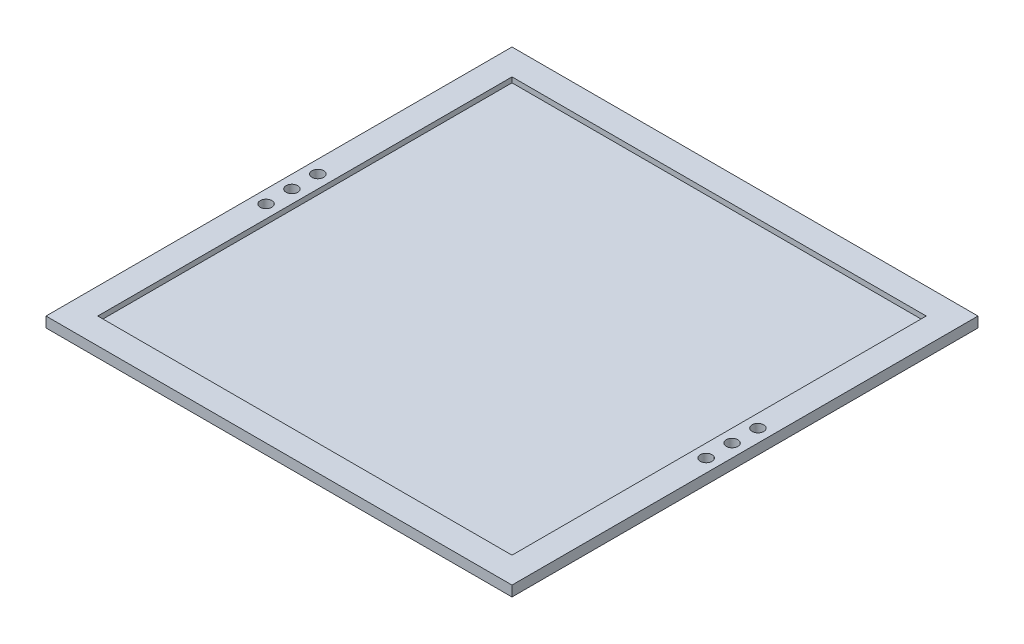
ISO-10303-21;
HEADER;
FILE_DESCRIPTION(('STEP AP214'),'2;1');
FILE_NAME('part.step','',(''),(''),'','','');
FILE_SCHEMA(('AUTOMOTIVE_DESIGN { 1 0 10303 214 1 1 1 1 }'));
ENDSEC;
DATA;
#1=APPLICATION_CONTEXT('core data for automotive mechanical design processes');
#2=APPLICATION_PROTOCOL_DEFINITION('international standard','automotive_design',2000,#1);
#3=PRODUCT_CONTEXT('',#1,'mechanical');
#4=PRODUCT('Part','Part','',(#3));
#5=PRODUCT_RELATED_PRODUCT_CATEGORY('part','',(#4));
#6=PRODUCT_DEFINITION_FORMATION('','',#4);
#7=PRODUCT_DEFINITION_CONTEXT('part definition',#1,'design');
#8=PRODUCT_DEFINITION('design','',#6,#7);
#9=PRODUCT_DEFINITION_SHAPE('','',#8);
#10=(LENGTH_UNIT() NAMED_UNIT(*) SI_UNIT(.MILLI.,.METRE.));
#11=(NAMED_UNIT(*) PLANE_ANGLE_UNIT() SI_UNIT($,.RADIAN.));
#12=(NAMED_UNIT(*) SI_UNIT($,.STERADIAN.) SOLID_ANGLE_UNIT());
#13=UNCERTAINTY_MEASURE_WITH_UNIT(LENGTH_MEASURE(1.E-05),#10,'distance_accuracy_value','');
#14=(GEOMETRIC_REPRESENTATION_CONTEXT(3) GLOBAL_UNCERTAINTY_ASSIGNED_CONTEXT((#13)) GLOBAL_UNIT_ASSIGNED_CONTEXT((#10,
#11,#12)) REPRESENTATION_CONTEXT('',''));
#15=CARTESIAN_POINT('',(0.,0.,0.));
#16=DIRECTION('',(0.,0.,1.));
#17=DIRECTION('',(1.,0.,0.));
#18=AXIS2_PLACEMENT_3D('',#15,#16,#17);
#19=CARTESIAN_POINT('',(0.,0.,0.));
#20=DIRECTION('',(0.,1.,0.));
#21=DIRECTION('',(0.,0.,1.));
#22=AXIS2_PLACEMENT_3D('',#19,#20,#21);
#23=PLANE('',#22);
#24=CARTESIAN_POINT('',(-85.,0.,0.));
#25=DIRECTION('',(0.,1.,0.));
#26=DIRECTION('',(0.,0.,1.));
#27=AXIS2_PLACEMENT_3D('',#24,#25,#26);
#28=CIRCLE('',#27,2.25);
#29=CARTESIAN_POINT('',(-85.,0.,2.25000000000001));
#30=VERTEX_POINT('',#29);
#31=EDGE_CURVE('E440',#30,#30,#28,.T.);
#32=ORIENTED_EDGE('',*,*,#31,.T.);
#33=EDGE_LOOP('',(#32));
#34=FACE_BOUND('',#33,.T.);
#35=CARTESIAN_POINT('',(-85.,0.,10.));
#36=DIRECTION('',(0.,1.,0.));
#37=DIRECTION('',(0.,0.,1.));
#38=AXIS2_PLACEMENT_3D('',#35,#36,#37);
#39=CIRCLE('',#38,2.25);
#40=CARTESIAN_POINT('',(-85.,0.,12.25));
#41=VERTEX_POINT('',#40);
#42=EDGE_CURVE('E439',#41,#41,#39,.T.);
#43=ORIENTED_EDGE('',*,*,#42,.T.);
#44=EDGE_LOOP('',(#43));
#45=FACE_BOUND('',#44,.T.);
#46=CARTESIAN_POINT('',(-85.,0.,-9.99999999999998));
#47=DIRECTION('',(0.,1.,0.));
#48=DIRECTION('',(0.,0.,1.));
#49=AXIS2_PLACEMENT_3D('',#46,#47,#48);
#50=CIRCLE('',#49,2.25);
#51=CARTESIAN_POINT('',(-85.,0.,-7.74999999999998));
#52=VERTEX_POINT('',#51);
#53=EDGE_CURVE('E178',#52,#52,#50,.T.);
#54=ORIENTED_EDGE('',*,*,#53,.T.);
#55=EDGE_LOOP('',(#54));
#56=FACE_BOUND('',#55,.T.);
#57=DIRECTION('',(0.,0.,1.));
#58=VECTOR('',#57,1.);
#59=CARTESIAN_POINT('',(90.,0.,0.));
#60=LINE('',#59,#58);
#61=CARTESIAN_POINT('',(90.,0.,-90.));
#62=VERTEX_POINT('',#61);
#63=CARTESIAN_POINT('',(90.,0.,90.));
#64=VERTEX_POINT('',#63);
#65=EDGE_CURVE('E107',#62,#64,#60,.T.);
#66=ORIENTED_EDGE('',*,*,#65,.T.);
#67=DIRECTION('',(-1.,0.,0.));
#68=VECTOR('',#67,1.);
#69=CARTESIAN_POINT('',(-1.2490009027033E-13,0.,90.0000000000002));
#70=LINE('',#69,#68);
#71=CARTESIAN_POINT('',(-90.,0.,90.));
#72=VERTEX_POINT('',#71);
#73=EDGE_CURVE('E166',#64,#72,#70,.T.);
#74=ORIENTED_EDGE('',*,*,#73,.T.);
#75=DIRECTION('',(0.,0.,-1.));
#76=VECTOR('',#75,1.);
#77=CARTESIAN_POINT('',(-90.,0.,0.));
#78=LINE('',#77,#76);
#79=CARTESIAN_POINT('',(-90.,0.,-90.));
#80=VERTEX_POINT('',#79);
#81=EDGE_CURVE('E163',#72,#80,#78,.T.);
#82=ORIENTED_EDGE('',*,*,#81,.T.);
#83=DIRECTION('',(1.,0.,0.));
#84=VECTOR('',#83,1.);
#85=CARTESIAN_POINT('',(0.,0.,-90.));
#86=LINE('',#85,#84);
#87=EDGE_CURVE('E161',#80,#62,#86,.T.);
#88=ORIENTED_EDGE('',*,*,#87,.T.);
#89=EDGE_LOOP('',(#66,#74,#82,#88));
#90=FACE_BOUND('',#89,.T.);
#91=CARTESIAN_POINT('',(85.,0.,10.));
#92=DIRECTION('',(0.,1.,0.));
#93=DIRECTION('',(0.,0.,1.));
#94=AXIS2_PLACEMENT_3D('',#91,#92,#93);
#95=CIRCLE('',#94,2.25);
#96=CARTESIAN_POINT('',(85.,0.,12.25));
#97=VERTEX_POINT('',#96);
#98=EDGE_CURVE('E450',#97,#97,#95,.F.);
#99=ORIENTED_EDGE('',*,*,#98,.F.);
#100=EDGE_LOOP('',(#99));
#101=FACE_BOUND('',#100,.T.);
#102=CARTESIAN_POINT('',(85.,0.,0.));
#103=DIRECTION('',(0.,1.,0.));
#104=DIRECTION('',(0.,0.,1.));
#105=AXIS2_PLACEMENT_3D('',#102,#103,#104);
#106=CIRCLE('',#105,2.25);
#107=CARTESIAN_POINT('',(85.,0.,2.25000000000001));
#108=VERTEX_POINT('',#107);
#109=EDGE_CURVE('E445',#108,#108,#106,.F.);
#110=ORIENTED_EDGE('',*,*,#109,.F.);
#111=EDGE_LOOP('',(#110));
#112=FACE_BOUND('',#111,.T.);
#113=CARTESIAN_POINT('',(85.,0.,-9.99999999999998));
#114=DIRECTION('',(0.,1.,0.));
#115=DIRECTION('',(0.,0.,1.));
#116=AXIS2_PLACEMENT_3D('',#113,#114,#115);
#117=CIRCLE('',#116,2.25);
#118=CARTESIAN_POINT('',(85.,0.,-7.74999999999998));
#119=VERTEX_POINT('',#118);
#120=EDGE_CURVE('E441',#119,#119,#117,.F.);
#121=ORIENTED_EDGE('',*,*,#120,.F.);
#122=EDGE_LOOP('',(#121));
#123=FACE_BOUND('',#122,.T.);
#124=ADVANCED_FACE('F39',(#34,#45,#56,#90,#101,#112,#123),#23,.F.);
#125=CARTESIAN_POINT('',(0.,4.,0.));
#126=DIRECTION('',(0.,1.,0.));
#127=DIRECTION('',(0.,0.,1.));
#128=AXIS2_PLACEMENT_3D('',#125,#126,#127);
#129=PLANE('',#128);
#130=CARTESIAN_POINT('',(-85.,4.,0.));
#131=DIRECTION('',(0.,1.,0.));
#132=DIRECTION('',(0.,0.,1.));
#133=AXIS2_PLACEMENT_3D('',#130,#131,#132);
#134=CIRCLE('',#133,2.25);
#135=CARTESIAN_POINT('',(-85.,4.,2.25000000000001));
#136=VERTEX_POINT('',#135);
#137=EDGE_CURVE('E43',#136,#136,#134,.T.);
#138=ORIENTED_EDGE('',*,*,#137,.F.);
#139=EDGE_LOOP('',(#138));
#140=FACE_BOUND('',#139,.T.);
#141=CARTESIAN_POINT('',(-85.,4.,10.));
#142=DIRECTION('',(0.,1.,0.));
#143=DIRECTION('',(0.,0.,1.));
#144=AXIS2_PLACEMENT_3D('',#141,#142,#143);
#145=CIRCLE('',#144,2.25);
#146=CARTESIAN_POINT('',(-85.,4.,12.25));
#147=VERTEX_POINT('',#146);
#148=EDGE_CURVE('E186',#147,#147,#145,.T.);
#149=ORIENTED_EDGE('',*,*,#148,.F.);
#150=EDGE_LOOP('',(#149));
#151=FACE_BOUND('',#150,.T.);
#152=CARTESIAN_POINT('',(85.,4.,0.));
#153=DIRECTION('',(0.,1.,0.));
#154=DIRECTION('',(0.,0.,1.));
#155=AXIS2_PLACEMENT_3D('',#152,#153,#154);
#156=CIRCLE('',#155,2.25);
#157=CARTESIAN_POINT('',(85.,4.,2.25000000000001));
#158=VERTEX_POINT('',#157);
#159=EDGE_CURVE('E181',#158,#158,#156,.F.);
#160=ORIENTED_EDGE('',*,*,#159,.T.);
#161=EDGE_LOOP('',(#160));
#162=FACE_BOUND('',#161,.T.);
#163=DIRECTION('',(0.,0.,1.));
#164=VECTOR('',#163,1.);
#165=CARTESIAN_POINT('',(-80.,4.,0.));
#166=LINE('',#165,#164);
#167=CARTESIAN_POINT('',(-80.,4.,-80.));
#168=VERTEX_POINT('',#167);
#169=CARTESIAN_POINT('',(-80.,4.,80.));
#170=VERTEX_POINT('',#169);
#171=EDGE_CURVE('E129',#168,#170,#166,.T.);
#172=ORIENTED_EDGE('',*,*,#171,.F.);
#173=DIRECTION('',(-1.,0.,0.));
#174=VECTOR('',#173,1.);
#175=CARTESIAN_POINT('',(0.,4.,-80.));
#176=LINE('',#175,#174);
#177=CARTESIAN_POINT('',(80.,4.,-80.));
#178=VERTEX_POINT('',#177);
#179=EDGE_CURVE('E132',#178,#168,#176,.T.);
#180=ORIENTED_EDGE('',*,*,#179,.F.);
#181=DIRECTION('',(0.,0.,-1.));
#182=VECTOR('',#181,1.);
#183=CARTESIAN_POINT('',(80.,4.,0.));
#184=LINE('',#183,#182);
#185=CARTESIAN_POINT('',(80.,4.,80.));
#186=VERTEX_POINT('',#185);
#187=EDGE_CURVE('E135',#186,#178,#184,.T.);
#188=ORIENTED_EDGE('',*,*,#187,.F.);
#189=DIRECTION('',(1.,0.,0.));
#190=VECTOR('',#189,1.);
#191=CARTESIAN_POINT('',(0.,4.,80.));
#192=LINE('',#191,#190);
#193=EDGE_CURVE('E138',#170,#186,#192,.T.);
#194=ORIENTED_EDGE('',*,*,#193,.F.);
#195=EDGE_LOOP('',(#172,#180,#188,#194));
#196=FACE_BOUND('',#195,.T.);
#197=DIRECTION('',(0.,0.,1.));
#198=VECTOR('',#197,1.);
#199=CARTESIAN_POINT('',(90.,4.,0.));
#200=LINE('',#199,#198);
#201=CARTESIAN_POINT('',(90.,4.,-90.));
#202=VERTEX_POINT('',#201);
#203=CARTESIAN_POINT('',(90.,4.,90.));
#204=VERTEX_POINT('',#203);
#205=EDGE_CURVE('E104',#202,#204,#200,.T.);
#206=ORIENTED_EDGE('',*,*,#205,.F.);
#207=DIRECTION('',(1.,0.,0.));
#208=VECTOR('',#207,1.);
#209=CARTESIAN_POINT('',(0.,4.,-90.));
#210=LINE('',#209,#208);
#211=CARTESIAN_POINT('',(-90.,4.,-90.));
#212=VERTEX_POINT('',#211);
#213=EDGE_CURVE('E117',#212,#202,#210,.T.);
#214=ORIENTED_EDGE('',*,*,#213,.F.);
#215=DIRECTION('',(0.,0.,-1.));
#216=VECTOR('',#215,1.);
#217=CARTESIAN_POINT('',(-90.,4.,0.));
#218=LINE('',#217,#216);
#219=CARTESIAN_POINT('',(-90.,4.,90.));
#220=VERTEX_POINT('',#219);
#221=EDGE_CURVE('E123',#220,#212,#218,.T.);
#222=ORIENTED_EDGE('',*,*,#221,.F.);
#223=DIRECTION('',(-1.,0.,0.));
#224=VECTOR('',#223,1.);
#225=CARTESIAN_POINT('',(-1.2490009027033E-13,4.,90.0000000000002));
#226=LINE('',#225,#224);
#227=EDGE_CURVE('E120',#204,#220,#226,.T.);
#228=ORIENTED_EDGE('',*,*,#227,.F.);
#229=EDGE_LOOP('',(#206,#214,#222,#228));
#230=FACE_BOUND('',#229,.T.);
#231=CARTESIAN_POINT('',(-85.,4.,-9.99999999999998));
#232=DIRECTION('',(0.,1.,0.));
#233=DIRECTION('',(0.,0.,1.));
#234=AXIS2_PLACEMENT_3D('',#231,#232,#233);
#235=CIRCLE('',#234,2.25);
#236=CARTESIAN_POINT('',(-85.,4.,-7.74999999999998));
#237=VERTEX_POINT('',#236);
#238=EDGE_CURVE('E174',#237,#237,#235,.T.);
#239=ORIENTED_EDGE('',*,*,#238,.F.);
#240=EDGE_LOOP('',(#239));
#241=FACE_BOUND('',#240,.T.);
#242=CARTESIAN_POINT('',(85.,4.,10.));
#243=DIRECTION('',(0.,1.,0.));
#244=DIRECTION('',(0.,0.,1.));
#245=AXIS2_PLACEMENT_3D('',#242,#243,#244);
#246=CIRCLE('',#245,2.25);
#247=CARTESIAN_POINT('',(85.,4.,12.25));
#248=VERTEX_POINT('',#247);
#249=EDGE_CURVE('E177',#248,#248,#246,.F.);
#250=ORIENTED_EDGE('',*,*,#249,.T.);
#251=EDGE_LOOP('',(#250));
#252=FACE_BOUND('',#251,.T.);
#253=CARTESIAN_POINT('',(85.,4.,-9.99999999999998));
#254=DIRECTION('',(0.,1.,0.));
#255=DIRECTION('',(0.,0.,1.));
#256=AXIS2_PLACEMENT_3D('',#253,#254,#255);
#257=CIRCLE('',#256,2.25);
#258=CARTESIAN_POINT('',(85.,4.,-7.74999999999998));
#259=VERTEX_POINT('',#258);
#260=EDGE_CURVE('E184',#259,#259,#257,.F.);
#261=ORIENTED_EDGE('',*,*,#260,.T.);
#262=EDGE_LOOP('',(#261));
#263=FACE_BOUND('',#262,.T.);
#264=ADVANCED_FACE('F114',(#140,#151,#162,#196,#230,#241,#252,#263),#129,.T.);
#265=CARTESIAN_POINT('',(90.,2.,0.));
#266=DIRECTION('',(1.,0.,0.));
#267=DIRECTION('',(0.,0.,-1.));
#268=AXIS2_PLACEMENT_3D('',#265,#266,#267);
#269=PLANE('',#268);
#270=ORIENTED_EDGE('',*,*,#65,.F.);
#271=DIRECTION('',(0.,-1.,0.));
#272=VECTOR('',#271,1.);
#273=CARTESIAN_POINT('',(90.,2.,-90.));
#274=LINE('',#273,#272);
#275=EDGE_CURVE('E11',#202,#62,#274,.T.);
#276=ORIENTED_EDGE('',*,*,#275,.F.);
#277=ORIENTED_EDGE('',*,*,#205,.T.);
#278=DIRECTION('',(0.,-1.,0.));
#279=VECTOR('',#278,1.);
#280=CARTESIAN_POINT('',(90.,2.,90.));
#281=LINE('',#280,#279);
#282=EDGE_CURVE('E169',#204,#64,#281,.T.);
#283=ORIENTED_EDGE('',*,*,#282,.T.);
#284=EDGE_LOOP('',(#270,#276,#277,#283));
#285=FACE_BOUND('',#284,.T.);
#286=ADVANCED_FACE('F41',(#285),#269,.T.);
#287=CARTESIAN_POINT('',(0.,2.,-90.));
#288=DIRECTION('',(0.,0.,-1.));
#289=DIRECTION('',(-1.,0.,0.));
#290=AXIS2_PLACEMENT_3D('',#287,#288,#289);
#291=PLANE('',#290);
#292=ORIENTED_EDGE('',*,*,#87,.F.);
#293=DIRECTION('',(0.,-1.,0.));
#294=VECTOR('',#293,1.);
#295=CARTESIAN_POINT('',(-90.,2.,-90.));
#296=LINE('',#295,#294);
#297=EDGE_CURVE('E48',#212,#80,#296,.T.);
#298=ORIENTED_EDGE('',*,*,#297,.F.);
#299=ORIENTED_EDGE('',*,*,#213,.T.);
#300=ORIENTED_EDGE('',*,*,#275,.T.);
#301=EDGE_LOOP('',(#292,#298,#299,#300));
#302=FACE_BOUND('',#301,.T.);
#303=ADVANCED_FACE('F122',(#302),#291,.T.);
#304=CARTESIAN_POINT('',(-90.,2.,0.));
#305=DIRECTION('',(-1.,0.,0.));
#306=DIRECTION('',(0.,0.,1.));
#307=AXIS2_PLACEMENT_3D('',#304,#305,#306);
#308=PLANE('',#307);
#309=ORIENTED_EDGE('',*,*,#81,.F.);
#310=DIRECTION('',(0.,-1.,0.));
#311=VECTOR('',#310,1.);
#312=CARTESIAN_POINT('',(-90.,2.,90.));
#313=LINE('',#312,#311);
#314=EDGE_CURVE('E171',#220,#72,#313,.T.);
#315=ORIENTED_EDGE('',*,*,#314,.F.);
#316=ORIENTED_EDGE('',*,*,#221,.T.);
#317=ORIENTED_EDGE('',*,*,#297,.T.);
#318=EDGE_LOOP('',(#309,#315,#316,#317));
#319=FACE_BOUND('',#318,.T.);
#320=ADVANCED_FACE('F238',(#319),#308,.T.);
#321=CARTESIAN_POINT('',(-1.2490009027033E-13,2.,90.0000000000002));
#322=DIRECTION('',(0.,0.,1.));
#323=DIRECTION('',(1.,0.,0.));
#324=AXIS2_PLACEMENT_3D('',#321,#322,#323);
#325=PLANE('',#324);
#326=ORIENTED_EDGE('',*,*,#73,.F.);
#327=ORIENTED_EDGE('',*,*,#282,.F.);
#328=ORIENTED_EDGE('',*,*,#227,.T.);
#329=ORIENTED_EDGE('',*,*,#314,.T.);
#330=EDGE_LOOP('',(#326,#327,#328,#329));
#331=FACE_BOUND('',#330,.T.);
#332=ADVANCED_FACE('F235',(#331),#325,.T.);
#333=CARTESIAN_POINT('',(-80.,4.,0.));
#334=DIRECTION('',(1.,0.,0.));
#335=DIRECTION('',(0.,0.,-1.));
#336=AXIS2_PLACEMENT_3D('',#333,#334,#335);
#337=PLANE('',#336);
#338=DIRECTION('',(0.,-1.,0.));
#339=VECTOR('',#338,1.);
#340=CARTESIAN_POINT('',(-80.,4.,80.));
#341=LINE('',#340,#339);
#342=CARTESIAN_POINT('',(-80.,2.,80.));
#343=VERTEX_POINT('',#342);
#344=EDGE_CURVE('E141',#170,#343,#341,.T.);
#345=ORIENTED_EDGE('',*,*,#344,.T.);
#346=DIRECTION('',(0.,0.,-1.));
#347=VECTOR('',#346,1.);
#348=CARTESIAN_POINT('',(-80.,2.,0.));
#349=LINE('',#348,#347);
#350=CARTESIAN_POINT('',(-80.,2.,-80.));
#351=VERTEX_POINT('',#350);
#352=EDGE_CURVE('E158',#343,#351,#349,.T.);
#353=ORIENTED_EDGE('',*,*,#352,.T.);
#354=DIRECTION('',(0.,-1.,0.));
#355=VECTOR('',#354,1.);
#356=CARTESIAN_POINT('',(-80.,4.,-80.));
#357=LINE('',#356,#355);
#358=EDGE_CURVE('E150',#168,#351,#357,.T.);
#359=ORIENTED_EDGE('',*,*,#358,.F.);
#360=ORIENTED_EDGE('',*,*,#171,.T.);
#361=EDGE_LOOP('',(#345,#353,#359,#360));
#362=FACE_BOUND('',#361,.T.);
#363=ADVANCED_FACE('F213',(#362),#337,.T.);
#364=CARTESIAN_POINT('',(0.,4.,-80.));
#365=DIRECTION('',(0.,0.,1.));
#366=DIRECTION('',(1.,0.,0.));
#367=AXIS2_PLACEMENT_3D('',#364,#365,#366);
#368=PLANE('',#367);
#369=ORIENTED_EDGE('',*,*,#358,.T.);
#370=DIRECTION('',(1.,0.,0.));
#371=VECTOR('',#370,1.);
#372=CARTESIAN_POINT('',(0.,2.,-80.));
#373=LINE('',#372,#371);
#374=CARTESIAN_POINT('',(80.,2.,-80.));
#375=VERTEX_POINT('',#374);
#376=EDGE_CURVE('E56',#351,#375,#373,.T.);
#377=ORIENTED_EDGE('',*,*,#376,.T.);
#378=DIRECTION('',(0.,-1.,0.));
#379=VECTOR('',#378,1.);
#380=CARTESIAN_POINT('',(80.,4.,-80.));
#381=LINE('',#380,#379);
#382=EDGE_CURVE('E147',#178,#375,#381,.T.);
#383=ORIENTED_EDGE('',*,*,#382,.F.);
#384=ORIENTED_EDGE('',*,*,#179,.T.);
#385=EDGE_LOOP('',(#369,#377,#383,#384));
#386=FACE_BOUND('',#385,.T.);
#387=ADVANCED_FACE('F208',(#386),#368,.T.);
#388=CARTESIAN_POINT('',(80.,4.,0.));
#389=DIRECTION('',(-1.,0.,0.));
#390=DIRECTION('',(0.,0.,1.));
#391=AXIS2_PLACEMENT_3D('',#388,#389,#390);
#392=PLANE('',#391);
#393=ORIENTED_EDGE('',*,*,#382,.T.);
#394=DIRECTION('',(0.,0.,1.));
#395=VECTOR('',#394,1.);
#396=CARTESIAN_POINT('',(80.,2.,0.));
#397=LINE('',#396,#395);
#398=CARTESIAN_POINT('',(80.,2.,80.));
#399=VERTEX_POINT('',#398);
#400=EDGE_CURVE('E61',#375,#399,#397,.T.);
#401=ORIENTED_EDGE('',*,*,#400,.T.);
#402=DIRECTION('',(0.,-1.,0.));
#403=VECTOR('',#402,1.);
#404=CARTESIAN_POINT('',(80.,4.,80.));
#405=LINE('',#404,#403);
#406=EDGE_CURVE('E144',#186,#399,#405,.T.);
#407=ORIENTED_EDGE('',*,*,#406,.F.);
#408=ORIENTED_EDGE('',*,*,#187,.T.);
#409=EDGE_LOOP('',(#393,#401,#407,#408));
#410=FACE_BOUND('',#409,.T.);
#411=ADVANCED_FACE('F210',(#410),#392,.T.);
#412=CARTESIAN_POINT('',(0.,4.,80.));
#413=DIRECTION('',(0.,0.,-1.));
#414=DIRECTION('',(-1.,0.,0.));
#415=AXIS2_PLACEMENT_3D('',#412,#413,#414);
#416=PLANE('',#415);
#417=ORIENTED_EDGE('',*,*,#406,.T.);
#418=DIRECTION('',(-1.,0.,0.));
#419=VECTOR('',#418,1.);
#420=CARTESIAN_POINT('',(0.,2.,80.));
#421=LINE('',#420,#419);
#422=EDGE_CURVE('E153',#399,#343,#421,.T.);
#423=ORIENTED_EDGE('',*,*,#422,.T.);
#424=ORIENTED_EDGE('',*,*,#344,.F.);
#425=ORIENTED_EDGE('',*,*,#193,.T.);
#426=EDGE_LOOP('',(#417,#423,#424,#425));
#427=FACE_BOUND('',#426,.T.);
#428=ADVANCED_FACE('F212',(#427),#416,.T.);
#429=CARTESIAN_POINT('',(0.,2.,0.));
#430=DIRECTION('',(0.,1.,0.));
#431=DIRECTION('',(0.,0.,1.));
#432=AXIS2_PLACEMENT_3D('',#429,#430,#431);
#433=PLANE('',#432);
#434=ORIENTED_EDGE('',*,*,#352,.F.);
#435=ORIENTED_EDGE('',*,*,#422,.F.);
#436=ORIENTED_EDGE('',*,*,#400,.F.);
#437=ORIENTED_EDGE('',*,*,#376,.F.);
#438=EDGE_LOOP('',(#434,#435,#436,#437));
#439=FACE_BOUND('',#438,.T.);
#440=ADVANCED_FACE('F214',(#439),#433,.T.);
#441=CARTESIAN_POINT('',(-85.,0.,-9.99999999999998));
#442=DIRECTION('',(0.,1.,0.));
#443=DIRECTION('',(0.,0.,1.));
#444=AXIS2_PLACEMENT_3D('',#441,#442,#443);
#445=CYLINDRICAL_SURFACE('',#444,2.25);
#446=ORIENTED_EDGE('',*,*,#238,.T.);
#447=EDGE_LOOP('',(#446));
#448=FACE_BOUND('',#447,.T.);
#449=ORIENTED_EDGE('',*,*,#53,.F.);
#450=EDGE_LOOP('',(#449));
#451=FACE_BOUND('',#450,.T.);
#452=ADVANCED_FACE('F216',(#448,#451),#445,.F.);
#453=CARTESIAN_POINT('',(85.,0.,10.));
#454=DIRECTION('',(0.,1.,0.));
#455=DIRECTION('',(0.,0.,1.));
#456=AXIS2_PLACEMENT_3D('',#453,#454,#455);
#457=CYLINDRICAL_SURFACE('',#456,2.25);
#458=ORIENTED_EDGE('',*,*,#249,.F.);
#459=EDGE_LOOP('',(#458));
#460=FACE_BOUND('',#459,.T.);
#461=ORIENTED_EDGE('',*,*,#98,.T.);
#462=EDGE_LOOP('',(#461));
#463=FACE_BOUND('',#462,.T.);
#464=ADVANCED_FACE('F222',(#460,#463),#457,.F.);
#465=CARTESIAN_POINT('',(85.,0.,0.));
#466=DIRECTION('',(0.,1.,0.));
#467=DIRECTION('',(0.,0.,1.));
#468=AXIS2_PLACEMENT_3D('',#465,#466,#467);
#469=CYLINDRICAL_SURFACE('',#468,2.25);
#470=ORIENTED_EDGE('',*,*,#159,.F.);
#471=EDGE_LOOP('',(#470));
#472=FACE_BOUND('',#471,.T.);
#473=ORIENTED_EDGE('',*,*,#109,.T.);
#474=EDGE_LOOP('',(#473));
#475=FACE_BOUND('',#474,.T.);
#476=ADVANCED_FACE('F272',(#472,#475),#469,.F.);
#477=CARTESIAN_POINT('',(85.,0.,-9.99999999999998));
#478=DIRECTION('',(0.,1.,0.));
#479=DIRECTION('',(0.,0.,1.));
#480=AXIS2_PLACEMENT_3D('',#477,#478,#479);
#481=CYLINDRICAL_SURFACE('',#480,2.25);
#482=ORIENTED_EDGE('',*,*,#260,.F.);
#483=EDGE_LOOP('',(#482));
#484=FACE_BOUND('',#483,.T.);
#485=ORIENTED_EDGE('',*,*,#120,.T.);
#486=EDGE_LOOP('',(#485));
#487=FACE_BOUND('',#486,.T.);
#488=ADVANCED_FACE('F283',(#484,#487),#481,.F.);
#489=CARTESIAN_POINT('',(-85.,0.,10.));
#490=DIRECTION('',(0.,1.,0.));
#491=DIRECTION('',(0.,0.,1.));
#492=AXIS2_PLACEMENT_3D('',#489,#490,#491);
#493=CYLINDRICAL_SURFACE('',#492,2.25);
#494=ORIENTED_EDGE('',*,*,#148,.T.);
#495=EDGE_LOOP('',(#494));
#496=FACE_BOUND('',#495,.T.);
#497=ORIENTED_EDGE('',*,*,#42,.F.);
#498=EDGE_LOOP('',(#497));
#499=FACE_BOUND('',#498,.T.);
#500=ADVANCED_FACE('F294',(#496,#499),#493,.F.);
#501=CARTESIAN_POINT('',(-85.,0.,0.));
#502=DIRECTION('',(0.,1.,0.));
#503=DIRECTION('',(0.,0.,1.));
#504=AXIS2_PLACEMENT_3D('',#501,#502,#503);
#505=CYLINDRICAL_SURFACE('',#504,2.25);
#506=ORIENTED_EDGE('',*,*,#137,.T.);
#507=EDGE_LOOP('',(#506));
#508=FACE_BOUND('',#507,.T.);
#509=ORIENTED_EDGE('',*,*,#31,.F.);
#510=EDGE_LOOP('',(#509));
#511=FACE_BOUND('',#510,.T.);
#512=ADVANCED_FACE('F193',(#508,#511),#505,.F.);
#513=CLOSED_SHELL('',(#124,#264,#286,#303,#320,#332,#363,#387,#411,#428,#440,#452,#464,#476,
#488,#500,#512));
#514=MANIFOLD_SOLID_BREP('B2',#513);
#515=ADVANCED_BREP_SHAPE_REPRESENTATION('',(#18,#514),#14);
#516=SHAPE_DEFINITION_REPRESENTATION(#9,#515);
ENDSEC;
END-ISO-10303-21;
